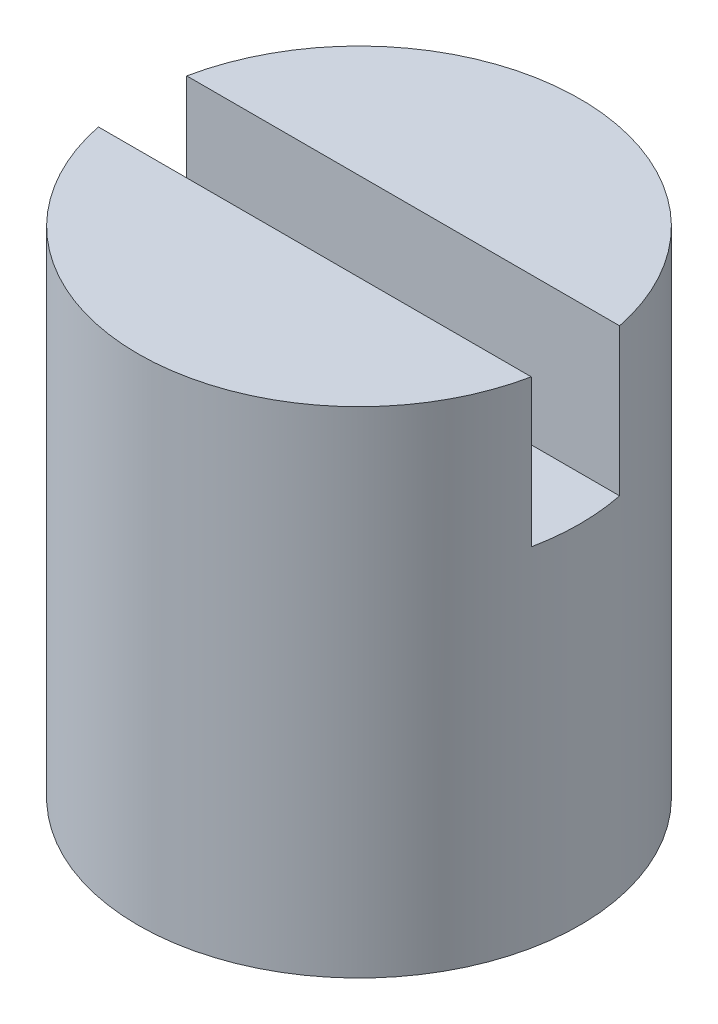
ISO-10303-21;
HEADER;
FILE_DESCRIPTION(('STEP AP214'),'2;1');
FILE_NAME('part.step','',(''),(''),'','','');
FILE_SCHEMA(('AUTOMOTIVE_DESIGN { 1 0 10303 214 1 1 1 1 }'));
ENDSEC;
DATA;
#1=APPLICATION_CONTEXT('core data for automotive mechanical design processes');
#2=APPLICATION_PROTOCOL_DEFINITION('international standard','automotive_design',2000,#1);
#3=PRODUCT_CONTEXT('',#1,'mechanical');
#4=PRODUCT('Part','Part','',(#3));
#5=PRODUCT_RELATED_PRODUCT_CATEGORY('part','',(#4));
#6=PRODUCT_DEFINITION_FORMATION('','',#4);
#7=PRODUCT_DEFINITION_CONTEXT('part definition',#1,'design');
#8=PRODUCT_DEFINITION('design','',#6,#7);
#9=PRODUCT_DEFINITION_SHAPE('','',#8);
#10=(LENGTH_UNIT() NAMED_UNIT(*) SI_UNIT(.MILLI.,.METRE.));
#11=(NAMED_UNIT(*) PLANE_ANGLE_UNIT() SI_UNIT($,.RADIAN.));
#12=(NAMED_UNIT(*) SI_UNIT($,.STERADIAN.) SOLID_ANGLE_UNIT());
#13=UNCERTAINTY_MEASURE_WITH_UNIT(LENGTH_MEASURE(1.E-05),#10,'distance_accuracy_value','');
#14=(GEOMETRIC_REPRESENTATION_CONTEXT(3) GLOBAL_UNCERTAINTY_ASSIGNED_CONTEXT((#13)) GLOBAL_UNIT_ASSIGNED_CONTEXT((#10,
#11,#12)) REPRESENTATION_CONTEXT('',''));
#15=CARTESIAN_POINT('',(0.,0.,0.));
#16=DIRECTION('',(0.,0.,1.));
#17=DIRECTION('',(1.,0.,0.));
#18=AXIS2_PLACEMENT_3D('',#15,#16,#17);
#19=CARTESIAN_POINT('',(0.,0.,0.));
#20=DIRECTION('',(0.,1.,0.));
#21=DIRECTION('',(0.,0.,1.));
#22=AXIS2_PLACEMENT_3D('',#19,#20,#21);
#23=PLANE('',#22);
#24=DIRECTION('',(-1.,0.,0.));
#25=VECTOR('',#24,1.);
#26=CARTESIAN_POINT('',(0.,0.,-0.952500000000001));
#27=LINE('',#26,#25);
#28=CARTESIAN_POINT('',(4.66627796000195,0.,-0.952500000000002));
#29=VERTEX_POINT('',#28);
#30=CARTESIAN_POINT('',(-4.66627796000195,0.,-0.9525));
#31=VERTEX_POINT('',#30);
#32=EDGE_CURVE('E89',#29,#31,#27,.T.);
#33=ORIENTED_EDGE('',*,*,#32,.F.);
#34=CARTESIAN_POINT('',(0.,0.,0.));
#35=DIRECTION('',(0.,1.,0.));
#36=DIRECTION('',(0.,0.,1.));
#37=AXIS2_PLACEMENT_3D('',#34,#35,#36);
#38=CIRCLE('',#37,4.7625);
#39=EDGE_CURVE('E100',#29,#31,#38,.T.);
#40=ORIENTED_EDGE('',*,*,#39,.T.);
#41=EDGE_LOOP('',(#33,#40));
#42=FACE_BOUND('',#41,.T.);
#43=ADVANCED_FACE('F41',(#42),#23,.T.);
#44=CARTESIAN_POINT('',(0.,-10.668,0.));
#45=DIRECTION('',(0.,1.,0.));
#46=DIRECTION('',(0.,0.,1.));
#47=AXIS2_PLACEMENT_3D('',#44,#45,#46);
#48=CYLINDRICAL_SURFACE('',#47,4.7625);
#49=DIRECTION('',(0.,1.,0.));
#50=VECTOR('',#49,1.);
#51=CARTESIAN_POINT('',(-4.66627796000195,-10.668,-0.9525));
#52=LINE('',#51,#50);
#53=CARTESIAN_POINT('',(-4.66627796000195,-3.175,-0.9525));
#54=VERTEX_POINT('',#53);
#55=EDGE_CURVE('E101',#31,#54,#52,.F.);
#56=ORIENTED_EDGE('',*,*,#55,.F.);
#57=ORIENTED_EDGE('',*,*,#39,.F.);
#58=DIRECTION('',(0.,1.,0.));
#59=VECTOR('',#58,1.);
#60=CARTESIAN_POINT('',(4.66627796000195,-10.668,-0.952500000000002));
#61=LINE('',#60,#59);
#62=CARTESIAN_POINT('',(4.66627796000195,-3.175,-0.952500000000002));
#63=VERTEX_POINT('',#62);
#64=EDGE_CURVE('E96',#63,#29,#61,.T.);
#65=ORIENTED_EDGE('',*,*,#64,.F.);
#66=CARTESIAN_POINT('',(0.,-3.175,0.));
#67=DIRECTION('',(0.,-1.,0.));
#68=DIRECTION('',(0.,0.,-1.));
#69=AXIS2_PLACEMENT_3D('',#66,#67,#68);
#70=CIRCLE('',#69,4.7625);
#71=CARTESIAN_POINT('',(4.66627796000195,-3.175,0.952499999999998));
#72=VERTEX_POINT('',#71);
#73=EDGE_CURVE('E45',#72,#63,#70,.F.);
#74=ORIENTED_EDGE('',*,*,#73,.F.);
#75=DIRECTION('',(0.,1.,0.));
#76=VECTOR('',#75,1.);
#77=CARTESIAN_POINT('',(4.66627796000195,-10.668,0.952499999999998));
#78=LINE('',#77,#76);
#79=CARTESIAN_POINT('',(4.66627796000195,0.,0.952499999999998));
#80=VERTEX_POINT('',#79);
#81=EDGE_CURVE('E83',#80,#72,#78,.F.);
#82=ORIENTED_EDGE('',*,*,#81,.F.);
#83=CARTESIAN_POINT('',(-4.66627796000195,0.,0.9525));
#84=VERTEX_POINT('',#83);
#85=EDGE_CURVE('E93',#84,#80,#38,.T.);
#86=ORIENTED_EDGE('',*,*,#85,.F.);
#87=DIRECTION('',(0.,1.,0.));
#88=VECTOR('',#87,1.);
#89=CARTESIAN_POINT('',(-4.66627796000195,-10.668,0.9525));
#90=LINE('',#89,#88);
#91=CARTESIAN_POINT('',(-4.66627796000195,-3.175,0.9525));
#92=VERTEX_POINT('',#91);
#93=EDGE_CURVE('E57',#92,#84,#90,.T.);
#94=ORIENTED_EDGE('',*,*,#93,.F.);
#95=EDGE_CURVE('E11',#54,#92,#70,.F.);
#96=ORIENTED_EDGE('',*,*,#95,.F.);
#97=EDGE_LOOP('',(#56,#57,#65,#74,#82,#86,#94,#96));
#98=FACE_BOUND('',#97,.T.);
#99=CARTESIAN_POINT('',(0.,-10.668,0.));
#100=DIRECTION('',(0.,1.,0.));
#101=DIRECTION('',(0.,0.,1.));
#102=AXIS2_PLACEMENT_3D('',#99,#100,#101);
#103=CIRCLE('',#102,4.7625);
#104=CARTESIAN_POINT('',(0.,-10.668,4.7625));
#105=VERTEX_POINT('',#104);
#106=EDGE_CURVE('E90',#105,#105,#103,.T.);
#107=ORIENTED_EDGE('',*,*,#106,.T.);
#108=EDGE_LOOP('',(#107));
#109=FACE_BOUND('',#108,.T.);
#110=ADVANCED_FACE('F43',(#98,#109),#48,.T.);
#111=CARTESIAN_POINT('',(0.,-10.668,0.));
#112=DIRECTION('',(0.,1.,0.));
#113=DIRECTION('',(0.,0.,1.));
#114=AXIS2_PLACEMENT_3D('',#111,#112,#113);
#115=PLANE('',#114);
#116=CARTESIAN_POINT('',(0.,-10.668,0.));
#117=DIRECTION('',(0.,-1.,0.));
#118=DIRECTION('',(0.,0.,-1.));
#119=AXIS2_PLACEMENT_3D('',#116,#117,#118);
#120=CIRCLE('',#119,1.999996);
#121=CARTESIAN_POINT('',(0.,-10.668,-1.999996));
#122=VERTEX_POINT('',#121);
#123=EDGE_CURVE('E130',#122,#122,#120,.T.);
#124=ORIENTED_EDGE('',*,*,#123,.F.);
#125=EDGE_LOOP('',(#124));
#126=FACE_BOUND('',#125,.T.);
#127=ORIENTED_EDGE('',*,*,#106,.F.);
#128=EDGE_LOOP('',(#127));
#129=FACE_BOUND('',#128,.T.);
#130=ADVANCED_FACE('F146',(#126,#129),#115,.F.);
#131=DIRECTION('',(1.,0.,0.));
#132=VECTOR('',#131,1.);
#133=CARTESIAN_POINT('',(0.,0.,0.952499999999999));
#134=LINE('',#133,#132);
#135=EDGE_CURVE('E80',#84,#80,#134,.T.);
#136=ORIENTED_EDGE('',*,*,#135,.F.);
#137=ORIENTED_EDGE('',*,*,#85,.T.);
#138=EDGE_LOOP('',(#136,#137));
#139=FACE_BOUND('',#138,.T.);
#140=ADVANCED_FACE('F98',(#139),#23,.T.);
#141=CARTESIAN_POINT('',(4.7625,-3.175,-0.952500000000002));
#142=DIRECTION('',(0.,0.,-1.));
#143=DIRECTION('',(-1.,0.,0.));
#144=AXIS2_PLACEMENT_3D('',#141,#142,#143);
#145=PLANE('',#144);
#146=ORIENTED_EDGE('',*,*,#55,.T.);
#147=DIRECTION('',(-1.,0.,0.));
#148=VECTOR('',#147,1.);
#149=CARTESIAN_POINT('',(4.7625,-3.175,-0.952500000000002));
#150=LINE('',#149,#148);
#151=EDGE_CURVE('E116',#63,#54,#150,.T.);
#152=ORIENTED_EDGE('',*,*,#151,.F.);
#153=ORIENTED_EDGE('',*,*,#64,.T.);
#154=ORIENTED_EDGE('',*,*,#32,.T.);
#155=EDGE_LOOP('',(#146,#152,#153,#154));
#156=FACE_BOUND('',#155,.T.);
#157=ADVANCED_FACE('F118',(#156),#145,.F.);
#158=CARTESIAN_POINT('',(4.7625,-3.175,0.952499999999998));
#159=DIRECTION('',(0.,0.,1.));
#160=DIRECTION('',(1.,0.,0.));
#161=AXIS2_PLACEMENT_3D('',#158,#159,#160);
#162=PLANE('',#161);
#163=ORIENTED_EDGE('',*,*,#81,.T.);
#164=DIRECTION('',(1.,0.,0.));
#165=VECTOR('',#164,1.);
#166=CARTESIAN_POINT('',(4.7625,-3.175,0.952499999999998));
#167=LINE('',#166,#165);
#168=EDGE_CURVE('E117',#92,#72,#167,.T.);
#169=ORIENTED_EDGE('',*,*,#168,.F.);
#170=ORIENTED_EDGE('',*,*,#93,.T.);
#171=ORIENTED_EDGE('',*,*,#135,.T.);
#172=EDGE_LOOP('',(#163,#169,#170,#171));
#173=FACE_BOUND('',#172,.T.);
#174=ADVANCED_FACE('F82',(#173),#162,.F.);
#175=CARTESIAN_POINT('',(0.,-3.175,0.));
#176=DIRECTION('',(0.,-1.,0.));
#177=DIRECTION('',(0.,0.,-1.));
#178=AXIS2_PLACEMENT_3D('',#175,#176,#177);
#179=PLANE('',#178);
#180=ORIENTED_EDGE('',*,*,#151,.T.);
#181=ORIENTED_EDGE('',*,*,#95,.T.);
#182=ORIENTED_EDGE('',*,*,#168,.T.);
#183=ORIENTED_EDGE('',*,*,#73,.T.);
#184=EDGE_LOOP('',(#180,#181,#182,#183));
#185=FACE_BOUND('',#184,.T.);
#186=ADVANCED_FACE('F115',(#185),#179,.F.);
#187=CARTESIAN_POINT('',(0.,-5.668,0.));
#188=DIRECTION('',(0.,-1.,0.));
#189=DIRECTION('',(0.,0.,-1.));
#190=AXIS2_PLACEMENT_3D('',#187,#188,#189);
#191=CYLINDRICAL_SURFACE('',#190,1.999996);
#192=CARTESIAN_POINT('',(0.,-5.668,0.));
#193=DIRECTION('',(0.,-1.,0.));
#194=DIRECTION('',(0.,0.,-1.));
#195=AXIS2_PLACEMENT_3D('',#192,#193,#194);
#196=CIRCLE('',#195,1.999996);
#197=CARTESIAN_POINT('',(0.,-5.668,-1.999996));
#198=VERTEX_POINT('',#197);
#199=EDGE_CURVE('E129',#198,#198,#196,.T.);
#200=ORIENTED_EDGE('',*,*,#199,.F.);
#201=EDGE_LOOP('',(#200));
#202=FACE_BOUND('',#201,.T.);
#203=ORIENTED_EDGE('',*,*,#123,.T.);
#204=EDGE_LOOP('',(#203));
#205=FACE_BOUND('',#204,.T.);
#206=ADVANCED_FACE('F140',(#202,#205),#191,.F.);
#207=CARTESIAN_POINT('',(0.,-5.668,0.));
#208=DIRECTION('',(0.,-1.,0.));
#209=DIRECTION('',(0.,0.,-1.));
#210=AXIS2_PLACEMENT_3D('',#207,#208,#209);
#211=PLANE('',#210);
#212=ORIENTED_EDGE('',*,*,#199,.T.);
#213=EDGE_LOOP('',(#212));
#214=FACE_BOUND('',#213,.T.);
#215=ADVANCED_FACE('F138',(#214),#211,.T.);
#216=CLOSED_SHELL('',(#43,#110,#130,#140,#157,#174,#186,#206,#215));
#217=MANIFOLD_SOLID_BREP('B2',#216);
#218=ADVANCED_BREP_SHAPE_REPRESENTATION('',(#18,#217),#14);
#219=SHAPE_DEFINITION_REPRESENTATION(#9,#218);
ENDSEC;
END-ISO-10303-21;
